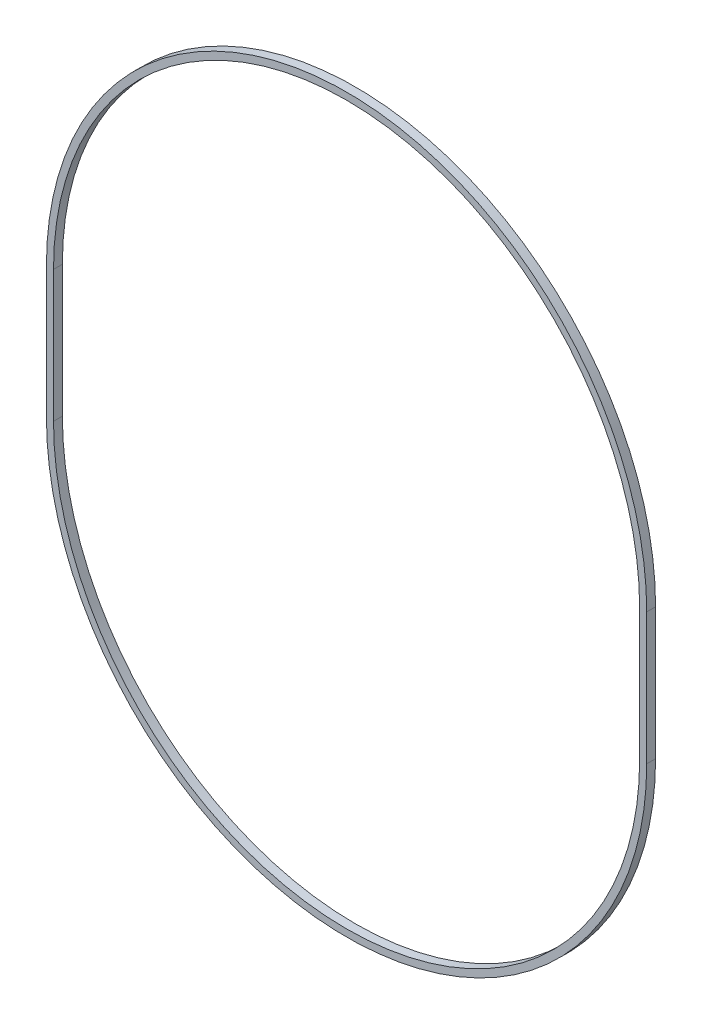
ISO-10303-21;
HEADER;
FILE_DESCRIPTION(('STEP AP214'),'2;1');
FILE_NAME('part.step','',(''),(''),'','','');
FILE_SCHEMA(('AUTOMOTIVE_DESIGN { 1 0 10303 214 1 1 1 1 }'));
ENDSEC;
DATA;
#1=APPLICATION_CONTEXT('core data for automotive mechanical design processes');
#2=APPLICATION_PROTOCOL_DEFINITION('international standard','automotive_design',2000,#1);
#3=PRODUCT_CONTEXT('',#1,'mechanical');
#4=PRODUCT('Part','Part','',(#3));
#5=PRODUCT_RELATED_PRODUCT_CATEGORY('part','',(#4));
#6=PRODUCT_DEFINITION_FORMATION('','',#4);
#7=PRODUCT_DEFINITION_CONTEXT('part definition',#1,'design');
#8=PRODUCT_DEFINITION('design','',#6,#7);
#9=PRODUCT_DEFINITION_SHAPE('','',#8);
#10=(LENGTH_UNIT() NAMED_UNIT(*) SI_UNIT(.MILLI.,.METRE.));
#11=(NAMED_UNIT(*) PLANE_ANGLE_UNIT() SI_UNIT($,.RADIAN.));
#12=(NAMED_UNIT(*) SI_UNIT($,.STERADIAN.) SOLID_ANGLE_UNIT());
#13=UNCERTAINTY_MEASURE_WITH_UNIT(LENGTH_MEASURE(1.E-05),#10,'distance_accuracy_value','');
#14=(GEOMETRIC_REPRESENTATION_CONTEXT(3) GLOBAL_UNCERTAINTY_ASSIGNED_CONTEXT((#13)) GLOBAL_UNIT_ASSIGNED_CONTEXT((#10,
#11,#12)) REPRESENTATION_CONTEXT('',''));
#15=CARTESIAN_POINT('',(0.,0.,0.));
#16=DIRECTION('',(0.,0.,1.));
#17=DIRECTION('',(1.,0.,0.));
#18=AXIS2_PLACEMENT_3D('',#15,#16,#17);
#19=CARTESIAN_POINT('',(-127.19,0.,1.875));
#20=DIRECTION('',(1.,0.,0.));
#21=DIRECTION('',(0.,0.,-1.));
#22=AXIS2_PLACEMENT_3D('',#19,#20,#21);
#23=PLANE('',#22);
#24=DIRECTION('',(0.,-1.,0.));
#25=VECTOR('',#24,1.);
#26=CARTESIAN_POINT('',(-127.19,0.,-1.875));
#27=LINE('',#26,#25);
#28=CARTESIAN_POINT('',(-127.19,27.875,-1.875));
#29=VERTEX_POINT('',#28);
#30=CARTESIAN_POINT('',(-127.19,-27.875,-1.875));
#31=VERTEX_POINT('',#30);
#32=EDGE_CURVE('E141',#29,#31,#27,.T.);
#33=ORIENTED_EDGE('',*,*,#32,.T.);
#34=DIRECTION('',(0.,0.,-1.));
#35=VECTOR('',#34,1.);
#36=CARTESIAN_POINT('',(-127.19,-27.875,1.875));
#37=LINE('',#36,#35);
#38=CARTESIAN_POINT('',(-127.19,-27.875,1.875));
#39=VERTEX_POINT('',#38);
#40=EDGE_CURVE('E11',#39,#31,#37,.T.);
#41=ORIENTED_EDGE('',*,*,#40,.F.);
#42=DIRECTION('',(0.,-1.,0.));
#43=VECTOR('',#42,1.);
#44=CARTESIAN_POINT('',(-127.19,0.,1.875));
#45=LINE('',#44,#43);
#46=CARTESIAN_POINT('',(-127.19,27.875,1.875));
#47=VERTEX_POINT('',#46);
#48=EDGE_CURVE('E115',#47,#39,#45,.T.);
#49=ORIENTED_EDGE('',*,*,#48,.F.);
#50=DIRECTION('',(0.,0.,-1.));
#51=VECTOR('',#50,1.);
#52=CARTESIAN_POINT('',(-127.19,27.875,1.875));
#53=LINE('',#52,#51);
#54=EDGE_CURVE('E148',#47,#29,#53,.T.);
#55=ORIENTED_EDGE('',*,*,#54,.T.);
#56=EDGE_LOOP('',(#33,#41,#49,#55));
#57=FACE_BOUND('',#56,.T.);
#58=ADVANCED_FACE('F34',(#57),#23,.F.);
#59=CARTESIAN_POINT('',(0.,-27.875,1.875));
#60=DIRECTION('',(0.,0.,-1.));
#61=DIRECTION('',(-1.,0.,0.));
#62=AXIS2_PLACEMENT_3D('',#59,#60,#61);
#63=CYLINDRICAL_SURFACE('',#62,127.19);
#64=CARTESIAN_POINT('',(0.,-27.875,-1.875));
#65=DIRECTION('',(0.,0.,1.));
#66=DIRECTION('',(1.,0.,0.));
#67=AXIS2_PLACEMENT_3D('',#64,#65,#66);
#68=CIRCLE('',#67,127.19);
#69=CARTESIAN_POINT('',(127.19,-27.875,-1.875));
#70=VERTEX_POINT('',#69);
#71=EDGE_CURVE('E120',#31,#70,#68,.T.);
#72=ORIENTED_EDGE('',*,*,#71,.T.);
#73=DIRECTION('',(0.,0.,-1.));
#74=VECTOR('',#73,1.);
#75=CARTESIAN_POINT('',(127.19,-27.875,1.875));
#76=LINE('',#75,#74);
#77=CARTESIAN_POINT('',(127.19,-27.875,1.875));
#78=VERTEX_POINT('',#77);
#79=EDGE_CURVE('E44',#78,#70,#76,.T.);
#80=ORIENTED_EDGE('',*,*,#79,.F.);
#81=CARTESIAN_POINT('',(0.,-27.875,1.875));
#82=DIRECTION('',(0.,0.,1.));
#83=DIRECTION('',(1.,0.,0.));
#84=AXIS2_PLACEMENT_3D('',#81,#82,#83);
#85=CIRCLE('',#84,127.19);
#86=EDGE_CURVE('E109',#39,#78,#85,.T.);
#87=ORIENTED_EDGE('',*,*,#86,.F.);
#88=ORIENTED_EDGE('',*,*,#40,.T.);
#89=EDGE_LOOP('',(#72,#80,#87,#88));
#90=FACE_BOUND('',#89,.T.);
#91=ADVANCED_FACE('F119',(#90),#63,.T.);
#92=CARTESIAN_POINT('',(127.19,0.,1.875));
#93=DIRECTION('',(-1.,0.,0.));
#94=DIRECTION('',(0.,0.,1.));
#95=AXIS2_PLACEMENT_3D('',#92,#93,#94);
#96=PLANE('',#95);
#97=DIRECTION('',(0.,1.,0.));
#98=VECTOR('',#97,1.);
#99=CARTESIAN_POINT('',(127.19,0.,-1.875));
#100=LINE('',#99,#98);
#101=CARTESIAN_POINT('',(127.19,27.875,-1.875));
#102=VERTEX_POINT('',#101);
#103=EDGE_CURVE('E82',#70,#102,#100,.T.);
#104=ORIENTED_EDGE('',*,*,#103,.T.);
#105=DIRECTION('',(0.,0.,-1.));
#106=VECTOR('',#105,1.);
#107=CARTESIAN_POINT('',(127.19,27.875,1.875));
#108=LINE('',#107,#106);
#109=CARTESIAN_POINT('',(127.19,27.875,1.875));
#110=VERTEX_POINT('',#109);
#111=EDGE_CURVE('E121',#110,#102,#108,.T.);
#112=ORIENTED_EDGE('',*,*,#111,.F.);
#113=DIRECTION('',(0.,1.,0.));
#114=VECTOR('',#113,1.);
#115=CARTESIAN_POINT('',(127.19,0.,1.875));
#116=LINE('',#115,#114);
#117=EDGE_CURVE('E113',#78,#110,#116,.T.);
#118=ORIENTED_EDGE('',*,*,#117,.F.);
#119=ORIENTED_EDGE('',*,*,#79,.T.);
#120=EDGE_LOOP('',(#104,#112,#118,#119));
#121=FACE_BOUND('',#120,.T.);
#122=ADVANCED_FACE('F123',(#121),#96,.F.);
#123=CARTESIAN_POINT('',(0.,-27.875,1.875));
#124=DIRECTION('',(0.,0.,-1.));
#125=DIRECTION('',(-1.,0.,0.));
#126=AXIS2_PLACEMENT_3D('',#123,#124,#125);
#127=CYLINDRICAL_SURFACE('',#126,124.19);
#128=CARTESIAN_POINT('',(0.,-27.875,-1.875));
#129=DIRECTION('',(0.,0.,1.));
#130=DIRECTION('',(1.,0.,0.));
#131=AXIS2_PLACEMENT_3D('',#128,#129,#130);
#132=CIRCLE('',#131,124.19);
#133=CARTESIAN_POINT('',(-124.19,-27.875,-1.875));
#134=VERTEX_POINT('',#133);
#135=CARTESIAN_POINT('',(124.19,-27.875,-1.875));
#136=VERTEX_POINT('',#135);
#137=EDGE_CURVE('E129',#134,#136,#132,.T.);
#138=ORIENTED_EDGE('',*,*,#137,.F.);
#139=DIRECTION('',(0.,0.,-1.));
#140=VECTOR('',#139,1.);
#141=CARTESIAN_POINT('',(-124.19,-27.875,1.875));
#142=LINE('',#141,#140);
#143=CARTESIAN_POINT('',(-124.19,-27.875,1.875));
#144=VERTEX_POINT('',#143);
#145=EDGE_CURVE('E38',#144,#134,#142,.T.);
#146=ORIENTED_EDGE('',*,*,#145,.F.);
#147=CARTESIAN_POINT('',(0.,-27.875,1.875));
#148=DIRECTION('',(0.,0.,1.));
#149=DIRECTION('',(1.,0.,0.));
#150=AXIS2_PLACEMENT_3D('',#147,#148,#149);
#151=CIRCLE('',#150,124.19);
#152=CARTESIAN_POINT('',(124.19,-27.875,1.875));
#153=VERTEX_POINT('',#152);
#154=EDGE_CURVE('E147',#144,#153,#151,.T.);
#155=ORIENTED_EDGE('',*,*,#154,.T.);
#156=DIRECTION('',(0.,0.,-1.));
#157=VECTOR('',#156,1.);
#158=CARTESIAN_POINT('',(124.19,-27.875,1.875));
#159=LINE('',#158,#157);
#160=EDGE_CURVE('E125',#153,#136,#159,.T.);
#161=ORIENTED_EDGE('',*,*,#160,.T.);
#162=EDGE_LOOP('',(#138,#146,#155,#161));
#163=FACE_BOUND('',#162,.T.);
#164=ADVANCED_FACE('F36',(#163),#127,.F.);
#165=CARTESIAN_POINT('',(-124.19,0.,1.875));
#166=DIRECTION('',(1.,0.,0.));
#167=DIRECTION('',(0.,1.,0.));
#168=AXIS2_PLACEMENT_3D('',#165,#166,#167);
#169=PLANE('',#168);
#170=DIRECTION('',(0.,-1.,0.));
#171=VECTOR('',#170,1.);
#172=CARTESIAN_POINT('',(-124.19,0.,-1.875));
#173=LINE('',#172,#171);
#174=CARTESIAN_POINT('',(-124.19,27.875,-1.875));
#175=VERTEX_POINT('',#174);
#176=EDGE_CURVE('E132',#175,#134,#173,.T.);
#177=ORIENTED_EDGE('',*,*,#176,.F.);
#178=DIRECTION('',(0.,0.,-1.));
#179=VECTOR('',#178,1.);
#180=CARTESIAN_POINT('',(-124.19,27.875,1.875));
#181=LINE('',#180,#179);
#182=CARTESIAN_POINT('',(-124.19,27.875,1.875));
#183=VERTEX_POINT('',#182);
#184=EDGE_CURVE('E153',#183,#175,#181,.T.);
#185=ORIENTED_EDGE('',*,*,#184,.F.);
#186=DIRECTION('',(0.,-1.,0.));
#187=VECTOR('',#186,1.);
#188=CARTESIAN_POINT('',(-124.19,0.,1.875));
#189=LINE('',#188,#187);
#190=EDGE_CURVE('E162',#183,#144,#189,.T.);
#191=ORIENTED_EDGE('',*,*,#190,.T.);
#192=ORIENTED_EDGE('',*,*,#145,.T.);
#193=EDGE_LOOP('',(#177,#185,#191,#192));
#194=FACE_BOUND('',#193,.T.);
#195=ADVANCED_FACE('F160',(#194),#169,.T.);
#196=CARTESIAN_POINT('',(0.,27.875,1.875));
#197=DIRECTION('',(0.,0.,-1.));
#198=DIRECTION('',(-1.,0.,0.));
#199=AXIS2_PLACEMENT_3D('',#196,#197,#198);
#200=CYLINDRICAL_SURFACE('',#199,124.19);
#201=CARTESIAN_POINT('',(0.,27.875,-1.875));
#202=DIRECTION('',(0.,0.,1.));
#203=DIRECTION('',(1.,0.,0.));
#204=AXIS2_PLACEMENT_3D('',#201,#202,#203);
#205=CIRCLE('',#204,124.19);
#206=CARTESIAN_POINT('',(124.19,27.875,-1.875));
#207=VERTEX_POINT('',#206);
#208=EDGE_CURVE('E135',#207,#175,#205,.T.);
#209=ORIENTED_EDGE('',*,*,#208,.F.);
#210=DIRECTION('',(0.,0.,-1.));
#211=VECTOR('',#210,1.);
#212=CARTESIAN_POINT('',(124.19,27.875,1.875));
#213=LINE('',#212,#211);
#214=CARTESIAN_POINT('',(124.19,27.875,1.875));
#215=VERTEX_POINT('',#214);
#216=EDGE_CURVE('E152',#215,#207,#213,.T.);
#217=ORIENTED_EDGE('',*,*,#216,.F.);
#218=CARTESIAN_POINT('',(0.,27.875,1.875));
#219=DIRECTION('',(0.,0.,1.));
#220=DIRECTION('',(1.,0.,0.));
#221=AXIS2_PLACEMENT_3D('',#218,#219,#220);
#222=CIRCLE('',#221,124.19);
#223=EDGE_CURVE('E169',#215,#183,#222,.T.);
#224=ORIENTED_EDGE('',*,*,#223,.T.);
#225=ORIENTED_EDGE('',*,*,#184,.T.);
#226=EDGE_LOOP('',(#209,#217,#224,#225));
#227=FACE_BOUND('',#226,.T.);
#228=ADVANCED_FACE('F167',(#227),#200,.F.);
#229=CARTESIAN_POINT('',(124.19,0.,1.875));
#230=DIRECTION('',(-1.,0.,0.));
#231=DIRECTION('',(0.,0.,1.));
#232=AXIS2_PLACEMENT_3D('',#229,#230,#231);
#233=PLANE('',#232);
#234=DIRECTION('',(0.,1.,0.));
#235=VECTOR('',#234,1.);
#236=CARTESIAN_POINT('',(124.19,0.,-1.875));
#237=LINE('',#236,#235);
#238=EDGE_CURVE('E138',#136,#207,#237,.T.);
#239=ORIENTED_EDGE('',*,*,#238,.F.);
#240=ORIENTED_EDGE('',*,*,#160,.F.);
#241=DIRECTION('',(0.,1.,0.));
#242=VECTOR('',#241,1.);
#243=CARTESIAN_POINT('',(124.19,0.,1.875));
#244=LINE('',#243,#242);
#245=EDGE_CURVE('E174',#153,#215,#244,.T.);
#246=ORIENTED_EDGE('',*,*,#245,.T.);
#247=ORIENTED_EDGE('',*,*,#216,.T.);
#248=EDGE_LOOP('',(#239,#240,#246,#247));
#249=FACE_BOUND('',#248,.T.);
#250=ADVANCED_FACE('F176',(#249),#233,.T.);
#251=CARTESIAN_POINT('',(0.,27.875,1.875));
#252=DIRECTION('',(0.,0.,-1.));
#253=DIRECTION('',(-1.,0.,0.));
#254=AXIS2_PLACEMENT_3D('',#251,#252,#253);
#255=CYLINDRICAL_SURFACE('',#254,127.19);
#256=CARTESIAN_POINT('',(0.,27.875,-1.875));
#257=DIRECTION('',(0.,0.,1.));
#258=DIRECTION('',(1.,0.,0.));
#259=AXIS2_PLACEMENT_3D('',#256,#257,#258);
#260=CIRCLE('',#259,127.19);
#261=EDGE_CURVE('E88',#102,#29,#260,.T.);
#262=ORIENTED_EDGE('',*,*,#261,.T.);
#263=ORIENTED_EDGE('',*,*,#54,.F.);
#264=CARTESIAN_POINT('',(0.,27.875,1.875));
#265=DIRECTION('',(0.,0.,1.));
#266=DIRECTION('',(1.,0.,0.));
#267=AXIS2_PLACEMENT_3D('',#264,#265,#266);
#268=CIRCLE('',#267,127.19);
#269=EDGE_CURVE('E53',#110,#47,#268,.T.);
#270=ORIENTED_EDGE('',*,*,#269,.F.);
#271=ORIENTED_EDGE('',*,*,#111,.T.);
#272=EDGE_LOOP('',(#262,#263,#270,#271));
#273=FACE_BOUND('',#272,.T.);
#274=ADVANCED_FACE('F181',(#273),#255,.T.);
#275=CARTESIAN_POINT('',(0.,0.,1.875));
#276=DIRECTION('',(0.,0.,1.));
#277=DIRECTION('',(1.,0.,0.));
#278=AXIS2_PLACEMENT_3D('',#275,#276,#277);
#279=PLANE('',#278);
#280=ORIENTED_EDGE('',*,*,#154,.F.);
#281=ORIENTED_EDGE('',*,*,#190,.F.);
#282=ORIENTED_EDGE('',*,*,#223,.F.);
#283=ORIENTED_EDGE('',*,*,#245,.F.);
#284=EDGE_LOOP('',(#280,#281,#282,#283));
#285=FACE_BOUND('',#284,.T.);
#286=ORIENTED_EDGE('',*,*,#48,.T.);
#287=ORIENTED_EDGE('',*,*,#86,.T.);
#288=ORIENTED_EDGE('',*,*,#117,.T.);
#289=ORIENTED_EDGE('',*,*,#269,.T.);
#290=EDGE_LOOP('',(#286,#287,#288,#289));
#291=FACE_BOUND('',#290,.T.);
#292=ADVANCED_FACE('F111',(#285,#291),#279,.T.);
#293=CARTESIAN_POINT('',(0.,0.,-1.875));
#294=DIRECTION('',(0.,0.,1.));
#295=DIRECTION('',(1.,0.,0.));
#296=AXIS2_PLACEMENT_3D('',#293,#294,#295);
#297=PLANE('',#296);
#298=ORIENTED_EDGE('',*,*,#137,.T.);
#299=ORIENTED_EDGE('',*,*,#238,.T.);
#300=ORIENTED_EDGE('',*,*,#208,.T.);
#301=ORIENTED_EDGE('',*,*,#176,.T.);
#302=EDGE_LOOP('',(#298,#299,#300,#301));
#303=FACE_BOUND('',#302,.T.);
#304=ORIENTED_EDGE('',*,*,#32,.F.);
#305=ORIENTED_EDGE('',*,*,#261,.F.);
#306=ORIENTED_EDGE('',*,*,#103,.F.);
#307=ORIENTED_EDGE('',*,*,#71,.F.);
#308=EDGE_LOOP('',(#304,#305,#306,#307));
#309=FACE_BOUND('',#308,.T.);
#310=ADVANCED_FACE('F165',(#303,#309),#297,.F.);
#311=CLOSED_SHELL('',(#58,#91,#122,#164,#195,#228,#250,#274,#292,#310));
#312=MANIFOLD_SOLID_BREP('B2',#311);
#313=ADVANCED_BREP_SHAPE_REPRESENTATION('',(#18,#312),#14);
#314=SHAPE_DEFINITION_REPRESENTATION(#9,#313);
ENDSEC;
END-ISO-10303-21;
